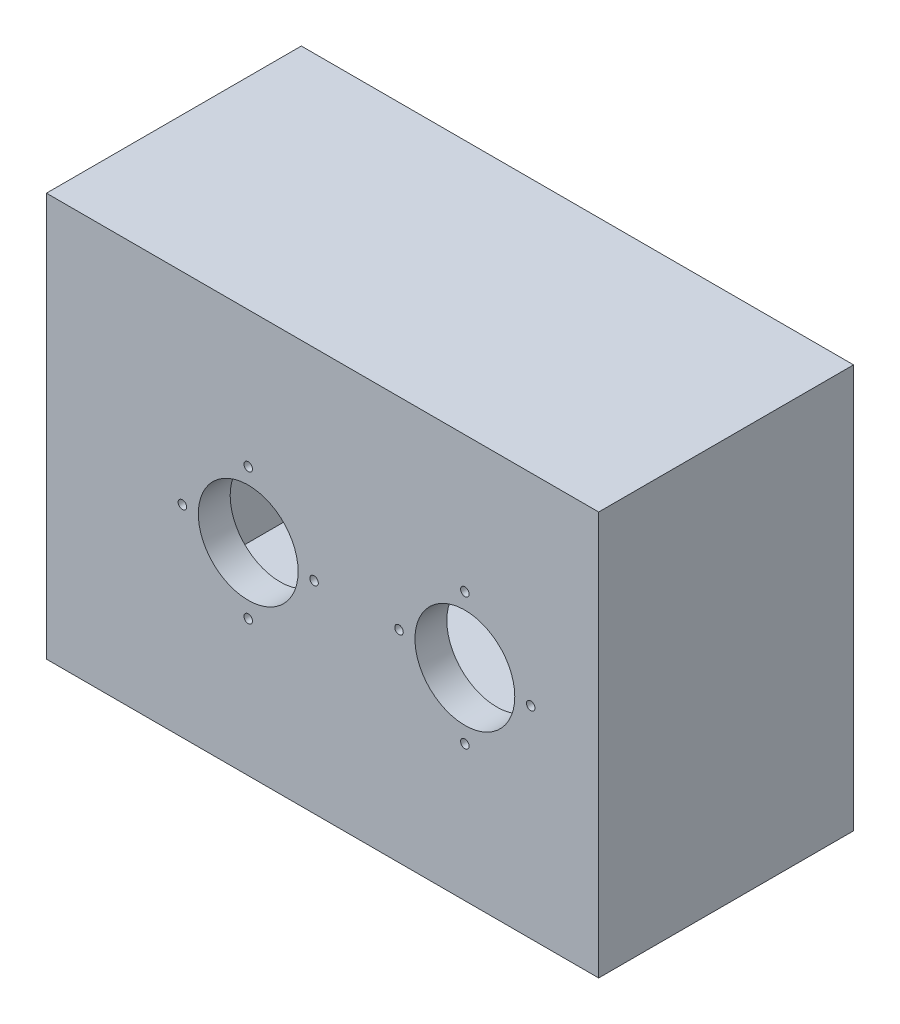
ISO-10303-21;
HEADER;
FILE_DESCRIPTION(('STEP AP214'),'2;1');
FILE_NAME('part.step','',(''),(''),'','','');
FILE_SCHEMA(('AUTOMOTIVE_DESIGN { 1 0 10303 214 1 1 1 1 }'));
ENDSEC;
DATA;
#1=APPLICATION_CONTEXT('core data for automotive mechanical design processes');
#2=APPLICATION_PROTOCOL_DEFINITION('international standard','automotive_design',2000,#1);
#3=PRODUCT_CONTEXT('',#1,'mechanical');
#4=PRODUCT('Part','Part','',(#3));
#5=PRODUCT_RELATED_PRODUCT_CATEGORY('part','',(#4));
#6=PRODUCT_DEFINITION_FORMATION('','',#4);
#7=PRODUCT_DEFINITION_CONTEXT('part definition',#1,'design');
#8=PRODUCT_DEFINITION('design','',#6,#7);
#9=PRODUCT_DEFINITION_SHAPE('','',#8);
#10=(LENGTH_UNIT() NAMED_UNIT(*) SI_UNIT(.MILLI.,.METRE.));
#11=(NAMED_UNIT(*) PLANE_ANGLE_UNIT() SI_UNIT($,.RADIAN.));
#12=(NAMED_UNIT(*) SI_UNIT($,.STERADIAN.) SOLID_ANGLE_UNIT());
#13=UNCERTAINTY_MEASURE_WITH_UNIT(LENGTH_MEASURE(1.E-05),#10,'distance_accuracy_value','');
#14=(GEOMETRIC_REPRESENTATION_CONTEXT(3) GLOBAL_UNCERTAINTY_ASSIGNED_CONTEXT((#13)) GLOBAL_UNIT_ASSIGNED_CONTEXT((#10,
#11,#12)) REPRESENTATION_CONTEXT('',''));
#15=CARTESIAN_POINT('',(0.,0.,0.));
#16=DIRECTION('',(0.,0.,1.));
#17=DIRECTION('',(1.,0.,0.));
#18=AXIS2_PLACEMENT_3D('',#15,#16,#17);
#19=CARTESIAN_POINT('',(-130.,190.,-45.));
#20=DIRECTION('',(0.,0.,1.));
#21=DIRECTION('',(1.,0.,0.));
#22=AXIS2_PLACEMENT_3D('',#19,#20,#21);
#23=PLANE('',#22);
#24=CARTESIAN_POINT('',(67.,126.,-45.));
#25=DIRECTION('',(0.,0.,1.));
#26=DIRECTION('',(1.,0.,0.));
#27=AXIS2_PLACEMENT_3D('',#24,#25,#26);
#28=CIRCLE('',#27,2.00000000000001);
#29=CARTESIAN_POINT('',(69.,126.,-45.));
#30=VERTEX_POINT('',#29);
#31=EDGE_CURVE('E367',#30,#30,#28,.F.);
#32=ORIENTED_EDGE('',*,*,#31,.T.);
#33=EDGE_LOOP('',(#32));
#34=FACE_BOUND('',#33,.T.);
#35=CARTESIAN_POINT('',(98.,95.,-45.));
#36=DIRECTION('',(0.,0.,1.));
#37=DIRECTION('',(1.,0.,0.));
#38=AXIS2_PLACEMENT_3D('',#35,#36,#37);
#39=CIRCLE('',#38,2.);
#40=CARTESIAN_POINT('',(100.,95.,-45.));
#41=VERTEX_POINT('',#40);
#42=EDGE_CURVE('E361',#41,#41,#39,.F.);
#43=ORIENTED_EDGE('',*,*,#42,.T.);
#44=EDGE_LOOP('',(#43));
#45=FACE_BOUND('',#44,.T.);
#46=CARTESIAN_POINT('',(67.,64.,-45.));
#47=DIRECTION('',(0.,0.,1.));
#48=DIRECTION('',(1.,0.,0.));
#49=AXIS2_PLACEMENT_3D('',#46,#47,#48);
#50=CIRCLE('',#49,2.00000000000001);
#51=CARTESIAN_POINT('',(69.,64.,-45.));
#52=VERTEX_POINT('',#51);
#53=EDGE_CURVE('E355',#52,#52,#50,.F.);
#54=ORIENTED_EDGE('',*,*,#53,.T.);
#55=EDGE_LOOP('',(#54));
#56=FACE_BOUND('',#55,.T.);
#57=CARTESIAN_POINT('',(36.,95.,-45.));
#58=DIRECTION('',(0.,0.,1.));
#59=DIRECTION('',(1.,0.,0.));
#60=AXIS2_PLACEMENT_3D('',#57,#58,#59);
#61=CIRCLE('',#60,2.);
#62=CARTESIAN_POINT('',(38.,95.,-45.));
#63=VERTEX_POINT('',#62);
#64=EDGE_CURVE('E345',#63,#63,#61,.F.);
#65=ORIENTED_EDGE('',*,*,#64,.T.);
#66=EDGE_LOOP('',(#65));
#67=FACE_BOUND('',#66,.T.);
#68=CARTESIAN_POINT('',(-35.,95.,-45.));
#69=DIRECTION('',(0.,0.,1.));
#70=DIRECTION('',(1.,0.,0.));
#71=AXIS2_PLACEMENT_3D('',#68,#69,#70);
#72=CIRCLE('',#71,23.5);
#73=CARTESIAN_POINT('',(-11.5,95.,-45.));
#74=VERTEX_POINT('',#73);
#75=EDGE_CURVE('E148',#74,#74,#72,.T.);
#76=ORIENTED_EDGE('',*,*,#75,.F.);
#77=EDGE_LOOP('',(#76));
#78=FACE_BOUND('',#77,.T.);
#79=CARTESIAN_POINT('',(67.,95.,-45.));
#80=DIRECTION('',(0.,0.,1.));
#81=DIRECTION('',(1.,0.,0.));
#82=AXIS2_PLACEMENT_3D('',#79,#80,#81);
#83=CIRCLE('',#82,23.5);
#84=CARTESIAN_POINT('',(90.5,95.,-45.));
#85=VERTEX_POINT('',#84);
#86=EDGE_CURVE('E231',#85,#85,#83,.T.);
#87=ORIENTED_EDGE('',*,*,#86,.F.);
#88=EDGE_LOOP('',(#87));
#89=FACE_BOUND('',#88,.T.);
#90=DIRECTION('',(-1.,0.,0.));
#91=VECTOR('',#90,1.);
#92=CARTESIAN_POINT('',(-130.,15.,-45.));
#93=LINE('',#92,#91);
#94=CARTESIAN_POINT('',(115.,15.,-45.));
#95=VERTEX_POINT('',#94);
#96=CARTESIAN_POINT('',(-115.,15.,-45.));
#97=VERTEX_POINT('',#96);
#98=EDGE_CURVE('E58',#95,#97,#93,.T.);
#99=ORIENTED_EDGE('',*,*,#98,.F.);
#100=DIRECTION('',(0.,-1.,0.));
#101=VECTOR('',#100,1.);
#102=CARTESIAN_POINT('',(115.,190.,-45.));
#103=LINE('',#102,#101);
#104=CARTESIAN_POINT('',(115.,175.,-45.));
#105=VERTEX_POINT('',#104);
#106=EDGE_CURVE('E168',#105,#95,#103,.T.);
#107=ORIENTED_EDGE('',*,*,#106,.F.);
#108=DIRECTION('',(-1.,0.,0.));
#109=VECTOR('',#108,1.);
#110=CARTESIAN_POINT('',(-130.,175.,-45.));
#111=LINE('',#110,#109);
#112=CARTESIAN_POINT('',(-115.,175.,-45.));
#113=VERTEX_POINT('',#112);
#114=EDGE_CURVE('E81',#105,#113,#111,.T.);
#115=ORIENTED_EDGE('',*,*,#114,.T.);
#116=DIRECTION('',(0.,-1.,0.));
#117=VECTOR('',#116,1.);
#118=CARTESIAN_POINT('',(-115.,190.,-45.));
#119=LINE('',#118,#117);
#120=EDGE_CURVE('E164',#113,#97,#119,.T.);
#121=ORIENTED_EDGE('',*,*,#120,.T.);
#122=EDGE_LOOP('',(#99,#107,#115,#121));
#123=FACE_BOUND('',#122,.T.);
#124=CARTESIAN_POINT('',(-4.,95.,-45.));
#125=DIRECTION('',(0.,0.,1.));
#126=DIRECTION('',(1.,0.,0.));
#127=AXIS2_PLACEMENT_3D('',#124,#125,#126);
#128=CIRCLE('',#127,2.);
#129=CARTESIAN_POINT('',(-2.00000000000001,95.,-45.));
#130=VERTEX_POINT('',#129);
#131=EDGE_CURVE('E349',#130,#130,#128,.T.);
#132=ORIENTED_EDGE('',*,*,#131,.F.);
#133=EDGE_LOOP('',(#132));
#134=FACE_BOUND('',#133,.T.);
#135=CARTESIAN_POINT('',(-35.,64.,-45.));
#136=DIRECTION('',(0.,0.,1.));
#137=DIRECTION('',(1.,0.,0.));
#138=AXIS2_PLACEMENT_3D('',#135,#136,#137);
#139=CIRCLE('',#138,2.);
#140=CARTESIAN_POINT('',(-33.,64.,-45.));
#141=VERTEX_POINT('',#140);
#142=EDGE_CURVE('E371',#141,#141,#139,.T.);
#143=ORIENTED_EDGE('',*,*,#142,.F.);
#144=EDGE_LOOP('',(#143));
#145=FACE_BOUND('',#144,.T.);
#146=CARTESIAN_POINT('',(-66.,95.,-45.));
#147=DIRECTION('',(0.,0.,1.));
#148=DIRECTION('',(1.,0.,0.));
#149=AXIS2_PLACEMENT_3D('',#146,#147,#148);
#150=CIRCLE('',#149,2.);
#151=CARTESIAN_POINT('',(-64.,95.,-45.));
#152=VERTEX_POINT('',#151);
#153=EDGE_CURVE('E208',#152,#152,#150,.T.);
#154=ORIENTED_EDGE('',*,*,#153,.F.);
#155=EDGE_LOOP('',(#154));
#156=FACE_BOUND('',#155,.T.);
#157=CARTESIAN_POINT('',(-35.,126.,-45.));
#158=DIRECTION('',(0.,0.,1.));
#159=DIRECTION('',(1.,0.,0.));
#160=AXIS2_PLACEMENT_3D('',#157,#158,#159);
#161=CIRCLE('',#160,2.);
#162=CARTESIAN_POINT('',(-33.,126.,-45.));
#163=VERTEX_POINT('',#162);
#164=EDGE_CURVE('E207',#163,#163,#161,.T.);
#165=ORIENTED_EDGE('',*,*,#164,.F.);
#166=EDGE_LOOP('',(#165));
#167=FACE_BOUND('',#166,.T.);
#168=ADVANCED_FACE('F39',(#34,#45,#56,#67,#78,#89,#123,#134,#145,#156,#167),#23,.T.);
#169=CARTESIAN_POINT('',(-130.,190.,45.));
#170=DIRECTION('',(0.,0.,-1.));
#171=DIRECTION('',(-1.,0.,0.));
#172=AXIS2_PLACEMENT_3D('',#169,#170,#171);
#173=PLANE('',#172);
#174=CARTESIAN_POINT('',(67.,126.,45.));
#175=DIRECTION('',(0.,0.,-1.));
#176=DIRECTION('',(-1.,0.,0.));
#177=AXIS2_PLACEMENT_3D('',#174,#175,#176);
#178=CIRCLE('',#177,2.00000000000001);
#179=CARTESIAN_POINT('',(65.,126.,45.));
#180=VERTEX_POINT('',#179);
#181=EDGE_CURVE('E364',#180,#180,#178,.F.);
#182=ORIENTED_EDGE('',*,*,#181,.T.);
#183=EDGE_LOOP('',(#182));
#184=FACE_BOUND('',#183,.T.);
#185=CARTESIAN_POINT('',(98.,95.,45.));
#186=DIRECTION('',(0.,0.,-1.));
#187=DIRECTION('',(-1.,0.,0.));
#188=AXIS2_PLACEMENT_3D('',#185,#186,#187);
#189=CIRCLE('',#188,2.);
#190=CARTESIAN_POINT('',(96.,95.,45.));
#191=VERTEX_POINT('',#190);
#192=EDGE_CURVE('E358',#191,#191,#189,.F.);
#193=ORIENTED_EDGE('',*,*,#192,.T.);
#194=EDGE_LOOP('',(#193));
#195=FACE_BOUND('',#194,.T.);
#196=CARTESIAN_POINT('',(67.,64.,45.));
#197=DIRECTION('',(0.,0.,-1.));
#198=DIRECTION('',(-1.,0.,0.));
#199=AXIS2_PLACEMENT_3D('',#196,#197,#198);
#200=CIRCLE('',#199,2.00000000000001);
#201=CARTESIAN_POINT('',(65.,64.,45.));
#202=VERTEX_POINT('',#201);
#203=EDGE_CURVE('E352',#202,#202,#200,.F.);
#204=ORIENTED_EDGE('',*,*,#203,.T.);
#205=EDGE_LOOP('',(#204));
#206=FACE_BOUND('',#205,.T.);
#207=CARTESIAN_POINT('',(36.,95.,45.));
#208=DIRECTION('',(0.,0.,-1.));
#209=DIRECTION('',(-1.,0.,0.));
#210=AXIS2_PLACEMENT_3D('',#207,#208,#209);
#211=CIRCLE('',#210,2.);
#212=CARTESIAN_POINT('',(34.,95.,45.));
#213=VERTEX_POINT('',#212);
#214=EDGE_CURVE('E339',#213,#213,#211,.F.);
#215=ORIENTED_EDGE('',*,*,#214,.T.);
#216=EDGE_LOOP('',(#215));
#217=FACE_BOUND('',#216,.T.);
#218=CARTESIAN_POINT('',(-35.,95.,45.));
#219=DIRECTION('',(0.,0.,-1.));
#220=DIRECTION('',(-1.,0.,0.));
#221=AXIS2_PLACEMENT_3D('',#218,#219,#220);
#222=CIRCLE('',#221,23.5);
#223=CARTESIAN_POINT('',(-58.5,95.,45.));
#224=VERTEX_POINT('',#223);
#225=EDGE_CURVE('E234',#224,#224,#222,.T.);
#226=ORIENTED_EDGE('',*,*,#225,.F.);
#227=EDGE_LOOP('',(#226));
#228=FACE_BOUND('',#227,.T.);
#229=CARTESIAN_POINT('',(67.,95.,45.));
#230=DIRECTION('',(0.,0.,-1.));
#231=DIRECTION('',(-1.,0.,0.));
#232=AXIS2_PLACEMENT_3D('',#229,#230,#231);
#233=CIRCLE('',#232,23.5);
#234=CARTESIAN_POINT('',(43.5,95.,45.));
#235=VERTEX_POINT('',#234);
#236=EDGE_CURVE('E220',#235,#235,#233,.T.);
#237=ORIENTED_EDGE('',*,*,#236,.F.);
#238=EDGE_LOOP('',(#237));
#239=FACE_BOUND('',#238,.T.);
#240=DIRECTION('',(1.,0.,0.));
#241=VECTOR('',#240,1.);
#242=CARTESIAN_POINT('',(-130.,15.,45.));
#243=LINE('',#242,#241);
#244=CARTESIAN_POINT('',(-115.,15.,45.));
#245=VERTEX_POINT('',#244);
#246=CARTESIAN_POINT('',(115.,15.,45.));
#247=VERTEX_POINT('',#246);
#248=EDGE_CURVE('E162',#245,#247,#243,.T.);
#249=ORIENTED_EDGE('',*,*,#248,.F.);
#250=DIRECTION('',(0.,-1.,0.));
#251=VECTOR('',#250,1.);
#252=CARTESIAN_POINT('',(-115.,190.,45.));
#253=LINE('',#252,#251);
#254=CARTESIAN_POINT('',(-115.,175.,45.));
#255=VERTEX_POINT('',#254);
#256=EDGE_CURVE('E159',#255,#245,#253,.T.);
#257=ORIENTED_EDGE('',*,*,#256,.F.);
#258=DIRECTION('',(1.,0.,0.));
#259=VECTOR('',#258,1.);
#260=CARTESIAN_POINT('',(-130.,175.,45.));
#261=LINE('',#260,#259);
#262=CARTESIAN_POINT('',(115.,175.,45.));
#263=VERTEX_POINT('',#262);
#264=EDGE_CURVE('E12',#255,#263,#261,.T.);
#265=ORIENTED_EDGE('',*,*,#264,.T.);
#266=DIRECTION('',(0.,-1.,0.));
#267=VECTOR('',#266,1.);
#268=CARTESIAN_POINT('',(115.,190.,45.));
#269=LINE('',#268,#267);
#270=EDGE_CURVE('E170',#263,#247,#269,.T.);
#271=ORIENTED_EDGE('',*,*,#270,.T.);
#272=EDGE_LOOP('',(#249,#257,#265,#271));
#273=FACE_BOUND('',#272,.T.);
#274=CARTESIAN_POINT('',(-4.,95.,45.));
#275=DIRECTION('',(0.,0.,-1.));
#276=DIRECTION('',(-1.,0.,0.));
#277=AXIS2_PLACEMENT_3D('',#274,#275,#276);
#278=CIRCLE('',#277,2.);
#279=CARTESIAN_POINT('',(-6.,95.,45.));
#280=VERTEX_POINT('',#279);
#281=EDGE_CURVE('E194',#280,#280,#278,.T.);
#282=ORIENTED_EDGE('',*,*,#281,.F.);
#283=EDGE_LOOP('',(#282));
#284=FACE_BOUND('',#283,.T.);
#285=CARTESIAN_POINT('',(-35.,64.,45.));
#286=DIRECTION('',(0.,0.,-1.));
#287=DIRECTION('',(-1.,0.,0.));
#288=AXIS2_PLACEMENT_3D('',#285,#286,#287);
#289=CIRCLE('',#288,2.);
#290=CARTESIAN_POINT('',(-37.,64.,45.));
#291=VERTEX_POINT('',#290);
#292=EDGE_CURVE('E198',#291,#291,#289,.T.);
#293=ORIENTED_EDGE('',*,*,#292,.F.);
#294=EDGE_LOOP('',(#293));
#295=FACE_BOUND('',#294,.T.);
#296=CARTESIAN_POINT('',(-66.,95.,45.));
#297=DIRECTION('',(0.,0.,-1.));
#298=DIRECTION('',(-1.,0.,0.));
#299=AXIS2_PLACEMENT_3D('',#296,#297,#298);
#300=CIRCLE('',#299,2.);
#301=CARTESIAN_POINT('',(-68.,95.,45.));
#302=VERTEX_POINT('',#301);
#303=EDGE_CURVE('E202',#302,#302,#300,.T.);
#304=ORIENTED_EDGE('',*,*,#303,.F.);
#305=EDGE_LOOP('',(#304));
#306=FACE_BOUND('',#305,.T.);
#307=CARTESIAN_POINT('',(-35.,126.,45.));
#308=DIRECTION('',(0.,0.,-1.));
#309=DIRECTION('',(-1.,0.,0.));
#310=AXIS2_PLACEMENT_3D('',#307,#308,#309);
#311=CIRCLE('',#310,2.);
#312=CARTESIAN_POINT('',(-37.,126.,45.));
#313=VERTEX_POINT('',#312);
#314=EDGE_CURVE('E205',#313,#313,#311,.T.);
#315=ORIENTED_EDGE('',*,*,#314,.F.);
#316=EDGE_LOOP('',(#315));
#317=FACE_BOUND('',#316,.T.);
#318=ADVANCED_FACE('F186',(#184,#195,#206,#217,#228,#239,#273,#284,#295,#306,#317),#173,.T.);
#319=CARTESIAN_POINT('',(-130.,190.,-60.));
#320=DIRECTION('',(0.,0.,1.));
#321=DIRECTION('',(1.,0.,0.));
#322=AXIS2_PLACEMENT_3D('',#319,#320,#321);
#323=PLANE('',#322);
#324=CARTESIAN_POINT('',(-66.,95.,-60.));
#325=DIRECTION('',(0.,0.,1.));
#326=DIRECTION('',(1.,0.,0.));
#327=AXIS2_PLACEMENT_3D('',#324,#325,#326);
#328=CIRCLE('',#327,2.);
#329=CARTESIAN_POINT('',(-64.,95.,-60.));
#330=VERTEX_POINT('',#329);
#331=EDGE_CURVE('E327',#330,#330,#328,.T.);
#332=ORIENTED_EDGE('',*,*,#331,.T.);
#333=EDGE_LOOP('',(#332));
#334=FACE_BOUND('',#333,.T.);
#335=CARTESIAN_POINT('',(-4.,95.,-60.));
#336=DIRECTION('',(0.,0.,1.));
#337=DIRECTION('',(1.,0.,0.));
#338=AXIS2_PLACEMENT_3D('',#335,#336,#337);
#339=CIRCLE('',#338,2.);
#340=CARTESIAN_POINT('',(-2.00000000000001,95.,-60.));
#341=VERTEX_POINT('',#340);
#342=EDGE_CURVE('E388',#341,#341,#339,.T.);
#343=ORIENTED_EDGE('',*,*,#342,.T.);
#344=EDGE_LOOP('',(#343));
#345=FACE_BOUND('',#344,.T.);
#346=CARTESIAN_POINT('',(36.,95.,-60.));
#347=DIRECTION('',(0.,0.,1.));
#348=DIRECTION('',(1.,0.,0.));
#349=AXIS2_PLACEMENT_3D('',#346,#347,#348);
#350=CIRCLE('',#349,2.);
#351=CARTESIAN_POINT('',(38.,95.,-60.));
#352=VERTEX_POINT('',#351);
#353=EDGE_CURVE('E336',#352,#352,#350,.F.);
#354=ORIENTED_EDGE('',*,*,#353,.F.);
#355=EDGE_LOOP('',(#354));
#356=FACE_BOUND('',#355,.T.);
#357=CARTESIAN_POINT('',(-35.,95.,-60.));
#358=DIRECTION('',(0.,0.,1.));
#359=DIRECTION('',(1.,0.,0.));
#360=AXIS2_PLACEMENT_3D('',#357,#358,#359);
#361=CIRCLE('',#360,23.5);
#362=CARTESIAN_POINT('',(-11.5,95.,-60.));
#363=VERTEX_POINT('',#362);
#364=EDGE_CURVE('E217',#363,#363,#361,.T.);
#365=ORIENTED_EDGE('',*,*,#364,.T.);
#366=EDGE_LOOP('',(#365));
#367=FACE_BOUND('',#366,.T.);
#368=CARTESIAN_POINT('',(67.,95.,-60.));
#369=DIRECTION('',(0.,0.,1.));
#370=DIRECTION('',(1.,0.,0.));
#371=AXIS2_PLACEMENT_3D('',#368,#369,#370);
#372=CIRCLE('',#371,23.5);
#373=CARTESIAN_POINT('',(90.5,95.,-60.));
#374=VERTEX_POINT('',#373);
#375=EDGE_CURVE('E211',#374,#374,#372,.T.);
#376=ORIENTED_EDGE('',*,*,#375,.T.);
#377=EDGE_LOOP('',(#376));
#378=FACE_BOUND('',#377,.T.);
#379=DIRECTION('',(-1.,0.,0.));
#380=VECTOR('',#379,1.);
#381=CARTESIAN_POINT('',(-130.,0.,-60.));
#382=LINE('',#381,#380);
#383=CARTESIAN_POINT('',(130.,0.,-60.));
#384=VERTEX_POINT('',#383);
#385=CARTESIAN_POINT('',(-130.,0.,-60.));
#386=VERTEX_POINT('',#385);
#387=EDGE_CURVE('E135',#384,#386,#382,.T.);
#388=ORIENTED_EDGE('',*,*,#387,.T.);
#389=DIRECTION('',(0.,-1.,0.));
#390=VECTOR('',#389,1.);
#391=CARTESIAN_POINT('',(-130.,190.,-60.));
#392=LINE('',#391,#390);
#393=CARTESIAN_POINT('',(-130.,190.,-60.));
#394=VERTEX_POINT('',#393);
#395=EDGE_CURVE('E132',#394,#386,#392,.T.);
#396=ORIENTED_EDGE('',*,*,#395,.F.);
#397=DIRECTION('',(-1.,0.,0.));
#398=VECTOR('',#397,1.);
#399=CARTESIAN_POINT('',(-130.,190.,-60.));
#400=LINE('',#399,#398);
#401=CARTESIAN_POINT('',(130.,190.,-60.));
#402=VERTEX_POINT('',#401);
#403=EDGE_CURVE('E124',#402,#394,#400,.T.);
#404=ORIENTED_EDGE('',*,*,#403,.F.);
#405=DIRECTION('',(0.,-1.,0.));
#406=VECTOR('',#405,1.);
#407=CARTESIAN_POINT('',(130.,190.,-60.));
#408=LINE('',#407,#406);
#409=EDGE_CURVE('E136',#402,#384,#408,.T.);
#410=ORIENTED_EDGE('',*,*,#409,.T.);
#411=EDGE_LOOP('',(#388,#396,#404,#410));
#412=FACE_BOUND('',#411,.T.);
#413=CARTESIAN_POINT('',(67.,64.,-60.));
#414=DIRECTION('',(0.,0.,1.));
#415=DIRECTION('',(1.,0.,0.));
#416=AXIS2_PLACEMENT_3D('',#413,#414,#415);
#417=CIRCLE('',#416,2.00000000000001);
#418=CARTESIAN_POINT('',(69.,64.,-60.));
#419=VERTEX_POINT('',#418);
#420=EDGE_CURVE('E402',#419,#419,#417,.F.);
#421=ORIENTED_EDGE('',*,*,#420,.F.);
#422=EDGE_LOOP('',(#421));
#423=FACE_BOUND('',#422,.T.);
#424=CARTESIAN_POINT('',(98.,95.,-60.));
#425=DIRECTION('',(0.,0.,1.));
#426=DIRECTION('',(1.,0.,0.));
#427=AXIS2_PLACEMENT_3D('',#424,#425,#426);
#428=CIRCLE('',#427,2.);
#429=CARTESIAN_POINT('',(100.,95.,-60.));
#430=VERTEX_POINT('',#429);
#431=EDGE_CURVE('E389',#430,#430,#428,.F.);
#432=ORIENTED_EDGE('',*,*,#431,.F.);
#433=EDGE_LOOP('',(#432));
#434=FACE_BOUND('',#433,.T.);
#435=CARTESIAN_POINT('',(67.,126.,-60.));
#436=DIRECTION('',(0.,0.,1.));
#437=DIRECTION('',(1.,0.,0.));
#438=AXIS2_PLACEMENT_3D('',#435,#436,#437);
#439=CIRCLE('',#438,2.00000000000001);
#440=CARTESIAN_POINT('',(69.,126.,-60.));
#441=VERTEX_POINT('',#440);
#442=EDGE_CURVE('E393',#441,#441,#439,.F.);
#443=ORIENTED_EDGE('',*,*,#442,.F.);
#444=EDGE_LOOP('',(#443));
#445=FACE_BOUND('',#444,.T.);
#446=CARTESIAN_POINT('',(-35.,64.,-60.));
#447=DIRECTION('',(0.,0.,1.));
#448=DIRECTION('',(1.,0.,0.));
#449=AXIS2_PLACEMENT_3D('',#446,#447,#448);
#450=CIRCLE('',#449,2.);
#451=CARTESIAN_POINT('',(-33.,64.,-60.));
#452=VERTEX_POINT('',#451);
#453=EDGE_CURVE('E383',#452,#452,#450,.T.);
#454=ORIENTED_EDGE('',*,*,#453,.T.);
#455=EDGE_LOOP('',(#454));
#456=FACE_BOUND('',#455,.T.);
#457=CARTESIAN_POINT('',(-35.,126.,-60.));
#458=DIRECTION('',(0.,0.,1.));
#459=DIRECTION('',(1.,0.,0.));
#460=AXIS2_PLACEMENT_3D('',#457,#458,#459);
#461=CIRCLE('',#460,2.);
#462=CARTESIAN_POINT('',(-33.,126.,-60.));
#463=VERTEX_POINT('',#462);
#464=EDGE_CURVE('E328',#463,#463,#461,.T.);
#465=ORIENTED_EDGE('',*,*,#464,.T.);
#466=EDGE_LOOP('',(#465));
#467=FACE_BOUND('',#466,.T.);
#468=ADVANCED_FACE('F133',(#334,#345,#356,#367,#378,#412,#423,#434,#445,#456,#467),#323,.F.);
#469=CARTESIAN_POINT('',(-130.,190.,60.));
#470=DIRECTION('',(0.,0.,-1.));
#471=DIRECTION('',(-1.,0.,0.));
#472=AXIS2_PLACEMENT_3D('',#469,#470,#471);
#473=PLANE('',#472);
#474=CARTESIAN_POINT('',(-66.,95.,60.));
#475=DIRECTION('',(0.,0.,1.));
#476=DIRECTION('',(1.,0.,0.));
#477=AXIS2_PLACEMENT_3D('',#474,#475,#476);
#478=CIRCLE('',#477,2.);
#479=CARTESIAN_POINT('',(-64.,95.,60.));
#480=VERTEX_POINT('',#479);
#481=EDGE_CURVE('E330',#480,#480,#478,.T.);
#482=ORIENTED_EDGE('',*,*,#481,.F.);
#483=EDGE_LOOP('',(#482));
#484=FACE_BOUND('',#483,.T.);
#485=CARTESIAN_POINT('',(-4.,95.,60.));
#486=DIRECTION('',(0.,0.,1.));
#487=DIRECTION('',(1.,0.,0.));
#488=AXIS2_PLACEMENT_3D('',#485,#486,#487);
#489=CIRCLE('',#488,2.);
#490=CARTESIAN_POINT('',(-2.00000000000001,95.,60.));
#491=VERTEX_POINT('',#490);
#492=EDGE_CURVE('E399',#491,#491,#489,.T.);
#493=ORIENTED_EDGE('',*,*,#492,.F.);
#494=EDGE_LOOP('',(#493));
#495=FACE_BOUND('',#494,.T.);
#496=CARTESIAN_POINT('',(36.,95.,60.));
#497=DIRECTION('',(0.,0.,1.));
#498=DIRECTION('',(1.,0.,0.));
#499=AXIS2_PLACEMENT_3D('',#496,#497,#498);
#500=CIRCLE('',#499,2.);
#501=CARTESIAN_POINT('',(38.,95.,60.));
#502=VERTEX_POINT('',#501);
#503=EDGE_CURVE('E340',#502,#502,#500,.F.);
#504=ORIENTED_EDGE('',*,*,#503,.T.);
#505=EDGE_LOOP('',(#504));
#506=FACE_BOUND('',#505,.T.);
#507=CARTESIAN_POINT('',(-35.,95.,60.));
#508=DIRECTION('',(0.,0.,1.));
#509=DIRECTION('',(1.,0.,0.));
#510=AXIS2_PLACEMENT_3D('',#507,#508,#509);
#511=CIRCLE('',#510,23.5);
#512=CARTESIAN_POINT('',(-11.5,95.,60.));
#513=VERTEX_POINT('',#512);
#514=EDGE_CURVE('E221',#513,#513,#511,.T.);
#515=ORIENTED_EDGE('',*,*,#514,.F.);
#516=EDGE_LOOP('',(#515));
#517=FACE_BOUND('',#516,.T.);
#518=CARTESIAN_POINT('',(67.,95.,60.));
#519=DIRECTION('',(0.,0.,1.));
#520=DIRECTION('',(1.,0.,0.));
#521=AXIS2_PLACEMENT_3D('',#518,#519,#520);
#522=CIRCLE('',#521,23.5);
#523=CARTESIAN_POINT('',(90.5,95.,60.));
#524=VERTEX_POINT('',#523);
#525=EDGE_CURVE('E224',#524,#524,#522,.T.);
#526=ORIENTED_EDGE('',*,*,#525,.F.);
#527=EDGE_LOOP('',(#526));
#528=FACE_BOUND('',#527,.T.);
#529=DIRECTION('',(1.,0.,0.));
#530=VECTOR('',#529,1.);
#531=CARTESIAN_POINT('',(-130.,0.,60.));
#532=LINE('',#531,#530);
#533=CARTESIAN_POINT('',(-130.,0.,60.));
#534=VERTEX_POINT('',#533);
#535=CARTESIAN_POINT('',(130.,0.,60.));
#536=VERTEX_POINT('',#535);
#537=EDGE_CURVE('E116',#534,#536,#532,.T.);
#538=ORIENTED_EDGE('',*,*,#537,.T.);
#539=DIRECTION('',(0.,-1.,0.));
#540=VECTOR('',#539,1.);
#541=CARTESIAN_POINT('',(130.,190.,60.));
#542=LINE('',#541,#540);
#543=CARTESIAN_POINT('',(130.,190.,60.));
#544=VERTEX_POINT('',#543);
#545=EDGE_CURVE('E141',#544,#536,#542,.T.);
#546=ORIENTED_EDGE('',*,*,#545,.F.);
#547=DIRECTION('',(1.,0.,0.));
#548=VECTOR('',#547,1.);
#549=CARTESIAN_POINT('',(-130.,190.,60.));
#550=LINE('',#549,#548);
#551=CARTESIAN_POINT('',(-130.,190.,60.));
#552=VERTEX_POINT('',#551);
#553=EDGE_CURVE('E93',#552,#544,#550,.T.);
#554=ORIENTED_EDGE('',*,*,#553,.F.);
#555=DIRECTION('',(0.,-1.,0.));
#556=VECTOR('',#555,1.);
#557=CARTESIAN_POINT('',(-130.,190.,60.));
#558=LINE('',#557,#556);
#559=EDGE_CURVE('E137',#552,#534,#558,.T.);
#560=ORIENTED_EDGE('',*,*,#559,.T.);
#561=EDGE_LOOP('',(#538,#546,#554,#560));
#562=FACE_BOUND('',#561,.T.);
#563=CARTESIAN_POINT('',(67.,64.,60.));
#564=DIRECTION('',(0.,0.,1.));
#565=DIRECTION('',(1.,0.,0.));
#566=AXIS2_PLACEMENT_3D('',#563,#564,#565);
#567=CIRCLE('',#566,2.00000000000001);
#568=CARTESIAN_POINT('',(69.,64.,60.));
#569=VERTEX_POINT('',#568);
#570=EDGE_CURVE('E310',#569,#569,#567,.F.);
#571=ORIENTED_EDGE('',*,*,#570,.T.);
#572=EDGE_LOOP('',(#571));
#573=FACE_BOUND('',#572,.T.);
#574=CARTESIAN_POINT('',(98.,95.,60.));
#575=DIRECTION('',(0.,0.,1.));
#576=DIRECTION('',(1.,0.,0.));
#577=AXIS2_PLACEMENT_3D('',#574,#575,#576);
#578=CIRCLE('',#577,2.);
#579=CARTESIAN_POINT('',(100.,95.,60.));
#580=VERTEX_POINT('',#579);
#581=EDGE_CURVE('E314',#580,#580,#578,.F.);
#582=ORIENTED_EDGE('',*,*,#581,.T.);
#583=EDGE_LOOP('',(#582));
#584=FACE_BOUND('',#583,.T.);
#585=CARTESIAN_POINT('',(67.,126.,60.));
#586=DIRECTION('',(0.,0.,1.));
#587=DIRECTION('',(1.,0.,0.));
#588=AXIS2_PLACEMENT_3D('',#585,#586,#587);
#589=CIRCLE('',#588,2.00000000000001);
#590=CARTESIAN_POINT('',(69.,126.,60.));
#591=VERTEX_POINT('',#590);
#592=EDGE_CURVE('E318',#591,#591,#589,.F.);
#593=ORIENTED_EDGE('',*,*,#592,.T.);
#594=EDGE_LOOP('',(#593));
#595=FACE_BOUND('',#594,.T.);
#596=CARTESIAN_POINT('',(-35.,64.,60.));
#597=DIRECTION('',(0.,0.,1.));
#598=DIRECTION('',(1.,0.,0.));
#599=AXIS2_PLACEMENT_3D('',#596,#597,#598);
#600=CIRCLE('',#599,2.);
#601=CARTESIAN_POINT('',(-33.,64.,60.));
#602=VERTEX_POINT('',#601);
#603=EDGE_CURVE('E322',#602,#602,#600,.T.);
#604=ORIENTED_EDGE('',*,*,#603,.F.);
#605=EDGE_LOOP('',(#604));
#606=FACE_BOUND('',#605,.T.);
#607=CARTESIAN_POINT('',(-35.,126.,60.));
#608=DIRECTION('',(0.,0.,1.));
#609=DIRECTION('',(1.,0.,0.));
#610=AXIS2_PLACEMENT_3D('',#607,#608,#609);
#611=CIRCLE('',#610,2.);
#612=CARTESIAN_POINT('',(-33.,126.,60.));
#613=VERTEX_POINT('',#612);
#614=EDGE_CURVE('E325',#613,#613,#611,.T.);
#615=ORIENTED_EDGE('',*,*,#614,.F.);
#616=EDGE_LOOP('',(#615));
#617=FACE_BOUND('',#616,.T.);
#618=ADVANCED_FACE('F258',(#484,#495,#506,#517,#528,#562,#573,#584,#595,#606,#617),#473,.F.);
#619=CARTESIAN_POINT('',(115.,190.,-60.));
#620=DIRECTION('',(-1.,0.,0.));
#621=DIRECTION('',(0.,0.,1.));
#622=AXIS2_PLACEMENT_3D('',#619,#620,#621);
#623=PLANE('',#622);
#624=DIRECTION('',(0.,0.,-1.));
#625=VECTOR('',#624,1.);
#626=CARTESIAN_POINT('',(115.,15.,-60.));
#627=LINE('',#626,#625);
#628=EDGE_CURVE('E43',#247,#95,#627,.T.);
#629=ORIENTED_EDGE('',*,*,#628,.F.);
#630=ORIENTED_EDGE('',*,*,#270,.F.);
#631=DIRECTION('',(0.,0.,-1.));
#632=VECTOR('',#631,1.);
#633=CARTESIAN_POINT('',(115.,175.,-60.));
#634=LINE('',#633,#632);
#635=EDGE_CURVE('E157',#263,#105,#634,.T.);
#636=ORIENTED_EDGE('',*,*,#635,.T.);
#637=ORIENTED_EDGE('',*,*,#106,.T.);
#638=EDGE_LOOP('',(#629,#630,#636,#637));
#639=FACE_BOUND('',#638,.T.);
#640=ADVANCED_FACE('F177',(#639),#623,.T.);
#641=CARTESIAN_POINT('',(-115.,190.,-60.));
#642=DIRECTION('',(1.,0.,0.));
#643=DIRECTION('',(0.,0.,-1.));
#644=AXIS2_PLACEMENT_3D('',#641,#642,#643);
#645=PLANE('',#644);
#646=DIRECTION('',(0.,0.,1.));
#647=VECTOR('',#646,1.);
#648=CARTESIAN_POINT('',(-115.,15.,-60.));
#649=LINE('',#648,#647);
#650=EDGE_CURVE('E166',#97,#245,#649,.T.);
#651=ORIENTED_EDGE('',*,*,#650,.F.);
#652=ORIENTED_EDGE('',*,*,#120,.F.);
#653=DIRECTION('',(0.,0.,1.));
#654=VECTOR('',#653,1.);
#655=CARTESIAN_POINT('',(-115.,175.,-60.));
#656=LINE('',#655,#654);
#657=EDGE_CURVE('E49',#113,#255,#656,.T.);
#658=ORIENTED_EDGE('',*,*,#657,.T.);
#659=ORIENTED_EDGE('',*,*,#256,.T.);
#660=EDGE_LOOP('',(#651,#652,#658,#659));
#661=FACE_BOUND('',#660,.T.);
#662=ADVANCED_FACE('F182',(#661),#645,.T.);
#663=CARTESIAN_POINT('',(0.,175.,0.));
#664=DIRECTION('',(0.,1.,0.));
#665=DIRECTION('',(0.,0.,1.));
#666=AXIS2_PLACEMENT_3D('',#663,#664,#665);
#667=PLANE('',#666);
#668=ORIENTED_EDGE('',*,*,#635,.F.);
#669=ORIENTED_EDGE('',*,*,#264,.F.);
#670=ORIENTED_EDGE('',*,*,#657,.F.);
#671=ORIENTED_EDGE('',*,*,#114,.F.);
#672=EDGE_LOOP('',(#668,#669,#670,#671));
#673=FACE_BOUND('',#672,.T.);
#674=ADVANCED_FACE('F185',(#673),#667,.F.);
#675=CARTESIAN_POINT('',(0.,15.,0.));
#676=DIRECTION('',(0.,1.,0.));
#677=DIRECTION('',(0.,0.,1.));
#678=AXIS2_PLACEMENT_3D('',#675,#676,#677);
#679=PLANE('',#678);
#680=ORIENTED_EDGE('',*,*,#628,.T.);
#681=ORIENTED_EDGE('',*,*,#98,.T.);
#682=ORIENTED_EDGE('',*,*,#650,.T.);
#683=ORIENTED_EDGE('',*,*,#248,.T.);
#684=EDGE_LOOP('',(#680,#681,#682,#683));
#685=FACE_BOUND('',#684,.T.);
#686=ADVANCED_FACE('F41',(#685),#679,.T.);
#687=CARTESIAN_POINT('',(67.,95.,-60.));
#688=DIRECTION('',(0.,0.,1.));
#689=DIRECTION('',(1.,0.,0.));
#690=AXIS2_PLACEMENT_3D('',#687,#688,#689);
#691=CYLINDRICAL_SURFACE('',#690,23.5);
#692=ORIENTED_EDGE('',*,*,#236,.T.);
#693=EDGE_LOOP('',(#692));
#694=FACE_BOUND('',#693,.T.);
#695=ORIENTED_EDGE('',*,*,#525,.T.);
#696=EDGE_LOOP('',(#695));
#697=FACE_BOUND('',#696,.T.);
#698=ADVANCED_FACE('F254',(#694,#697),#691,.F.);
#699=CARTESIAN_POINT('',(-35.,95.,-60.));
#700=DIRECTION('',(0.,0.,1.));
#701=DIRECTION('',(1.,0.,0.));
#702=AXIS2_PLACEMENT_3D('',#699,#700,#701);
#703=CYLINDRICAL_SURFACE('',#702,23.5);
#704=ORIENTED_EDGE('',*,*,#225,.T.);
#705=EDGE_LOOP('',(#704));
#706=FACE_BOUND('',#705,.T.);
#707=ORIENTED_EDGE('',*,*,#514,.T.);
#708=EDGE_LOOP('',(#707));
#709=FACE_BOUND('',#708,.T.);
#710=ADVANCED_FACE('F252',(#706,#709),#703,.F.);
#711=ORIENTED_EDGE('',*,*,#86,.T.);
#712=EDGE_LOOP('',(#711));
#713=FACE_BOUND('',#712,.T.);
#714=ORIENTED_EDGE('',*,*,#375,.F.);
#715=EDGE_LOOP('',(#714));
#716=FACE_BOUND('',#715,.T.);
#717=ADVANCED_FACE('F249',(#713,#716),#691,.F.);
#718=ORIENTED_EDGE('',*,*,#75,.T.);
#719=EDGE_LOOP('',(#718));
#720=FACE_BOUND('',#719,.T.);
#721=ORIENTED_EDGE('',*,*,#364,.F.);
#722=EDGE_LOOP('',(#721));
#723=FACE_BOUND('',#722,.T.);
#724=ADVANCED_FACE('F240',(#720,#723),#703,.F.);
#725=CARTESIAN_POINT('',(-130.,190.,-60.));
#726=DIRECTION('',(1.,0.,0.));
#727=DIRECTION('',(0.,0.,-1.));
#728=AXIS2_PLACEMENT_3D('',#725,#726,#727);
#729=PLANE('',#728);
#730=DIRECTION('',(0.,0.,1.));
#731=VECTOR('',#730,1.);
#732=CARTESIAN_POINT('',(-130.,0.,-60.));
#733=LINE('',#732,#731);
#734=EDGE_CURVE('E110',#386,#534,#733,.T.);
#735=ORIENTED_EDGE('',*,*,#734,.T.);
#736=ORIENTED_EDGE('',*,*,#559,.F.);
#737=DIRECTION('',(0.,0.,1.));
#738=VECTOR('',#737,1.);
#739=CARTESIAN_POINT('',(-130.,190.,-60.));
#740=LINE('',#739,#738);
#741=EDGE_CURVE('E127',#394,#552,#740,.T.);
#742=ORIENTED_EDGE('',*,*,#741,.F.);
#743=ORIENTED_EDGE('',*,*,#395,.T.);
#744=EDGE_LOOP('',(#735,#736,#742,#743));
#745=FACE_BOUND('',#744,.T.);
#746=ADVANCED_FACE('F139',(#745),#729,.F.);
#747=CARTESIAN_POINT('',(0.,190.,0.));
#748=DIRECTION('',(0.,1.,0.));
#749=DIRECTION('',(0.,0.,1.));
#750=AXIS2_PLACEMENT_3D('',#747,#748,#749);
#751=PLANE('',#750);
#752=DIRECTION('',(0.,0.,-1.));
#753=VECTOR('',#752,1.);
#754=CARTESIAN_POINT('',(130.,190.,-60.));
#755=LINE('',#754,#753);
#756=EDGE_CURVE('E129',#544,#402,#755,.T.);
#757=ORIENTED_EDGE('',*,*,#756,.T.);
#758=ORIENTED_EDGE('',*,*,#403,.T.);
#759=ORIENTED_EDGE('',*,*,#741,.T.);
#760=ORIENTED_EDGE('',*,*,#553,.T.);
#761=EDGE_LOOP('',(#757,#758,#759,#760));
#762=FACE_BOUND('',#761,.T.);
#763=ADVANCED_FACE('F125',(#762),#751,.T.);
#764=CARTESIAN_POINT('',(130.,190.,-60.));
#765=DIRECTION('',(-1.,0.,0.));
#766=DIRECTION('',(0.,0.,1.));
#767=AXIS2_PLACEMENT_3D('',#764,#765,#766);
#768=PLANE('',#767);
#769=DIRECTION('',(0.,0.,-1.));
#770=VECTOR('',#769,1.);
#771=CARTESIAN_POINT('',(130.,0.,-60.));
#772=LINE('',#771,#770);
#773=EDGE_CURVE('E145',#536,#384,#772,.T.);
#774=ORIENTED_EDGE('',*,*,#773,.T.);
#775=ORIENTED_EDGE('',*,*,#409,.F.);
#776=ORIENTED_EDGE('',*,*,#756,.F.);
#777=ORIENTED_EDGE('',*,*,#545,.T.);
#778=EDGE_LOOP('',(#774,#775,#776,#777));
#779=FACE_BOUND('',#778,.T.);
#780=ADVANCED_FACE('F270',(#779),#768,.F.);
#781=CARTESIAN_POINT('',(0.,0.,0.));
#782=DIRECTION('',(0.,1.,0.));
#783=DIRECTION('',(0.,0.,1.));
#784=AXIS2_PLACEMENT_3D('',#781,#782,#783);
#785=PLANE('',#784);
#786=ORIENTED_EDGE('',*,*,#773,.F.);
#787=ORIENTED_EDGE('',*,*,#537,.F.);
#788=ORIENTED_EDGE('',*,*,#734,.F.);
#789=ORIENTED_EDGE('',*,*,#387,.F.);
#790=EDGE_LOOP('',(#786,#787,#788,#789));
#791=FACE_BOUND('',#790,.T.);
#792=ADVANCED_FACE('F273',(#791),#785,.F.);
#793=CARTESIAN_POINT('',(36.,95.,-60.));
#794=DIRECTION('',(0.,0.,1.));
#795=DIRECTION('',(1.,0.,0.));
#796=AXIS2_PLACEMENT_3D('',#793,#794,#795);
#797=CYLINDRICAL_SURFACE('',#796,2.);
#798=ORIENTED_EDGE('',*,*,#214,.F.);
#799=EDGE_LOOP('',(#798));
#800=FACE_BOUND('',#799,.T.);
#801=ORIENTED_EDGE('',*,*,#503,.F.);
#802=EDGE_LOOP('',(#801));
#803=FACE_BOUND('',#802,.T.);
#804=ADVANCED_FACE('F297',(#800,#803),#797,.F.);
#805=CARTESIAN_POINT('',(-4.,95.,-60.));
#806=DIRECTION('',(0.,0.,1.));
#807=DIRECTION('',(1.,0.,0.));
#808=AXIS2_PLACEMENT_3D('',#805,#806,#807);
#809=CYLINDRICAL_SURFACE('',#808,2.);
#810=ORIENTED_EDGE('',*,*,#281,.T.);
#811=EDGE_LOOP('',(#810));
#812=FACE_BOUND('',#811,.T.);
#813=ORIENTED_EDGE('',*,*,#492,.T.);
#814=EDGE_LOOP('',(#813));
#815=FACE_BOUND('',#814,.T.);
#816=ADVANCED_FACE('F302',(#812,#815),#809,.F.);
#817=CARTESIAN_POINT('',(67.,64.,-60.));
#818=DIRECTION('',(0.,0.,1.));
#819=DIRECTION('',(1.,0.,0.));
#820=AXIS2_PLACEMENT_3D('',#817,#818,#819);
#821=CYLINDRICAL_SURFACE('',#820,2.00000000000001);
#822=ORIENTED_EDGE('',*,*,#203,.F.);
#823=EDGE_LOOP('',(#822));
#824=FACE_BOUND('',#823,.T.);
#825=ORIENTED_EDGE('',*,*,#570,.F.);
#826=EDGE_LOOP('',(#825));
#827=FACE_BOUND('',#826,.T.);
#828=ADVANCED_FACE('F535',(#824,#827),#821,.F.);
#829=CARTESIAN_POINT('',(98.,95.,-60.));
#830=DIRECTION('',(0.,0.,1.));
#831=DIRECTION('',(1.,0.,0.));
#832=AXIS2_PLACEMENT_3D('',#829,#830,#831);
#833=CYLINDRICAL_SURFACE('',#832,2.);
#834=ORIENTED_EDGE('',*,*,#192,.F.);
#835=EDGE_LOOP('',(#834));
#836=FACE_BOUND('',#835,.T.);
#837=ORIENTED_EDGE('',*,*,#581,.F.);
#838=EDGE_LOOP('',(#837));
#839=FACE_BOUND('',#838,.T.);
#840=ADVANCED_FACE('F544',(#836,#839),#833,.F.);
#841=CARTESIAN_POINT('',(67.,126.,-60.));
#842=DIRECTION('',(0.,0.,1.));
#843=DIRECTION('',(1.,0.,0.));
#844=AXIS2_PLACEMENT_3D('',#841,#842,#843);
#845=CYLINDRICAL_SURFACE('',#844,2.00000000000001);
#846=ORIENTED_EDGE('',*,*,#181,.F.);
#847=EDGE_LOOP('',(#846));
#848=FACE_BOUND('',#847,.T.);
#849=ORIENTED_EDGE('',*,*,#592,.F.);
#850=EDGE_LOOP('',(#849));
#851=FACE_BOUND('',#850,.T.);
#852=ADVANCED_FACE('F554',(#848,#851),#845,.F.);
#853=CARTESIAN_POINT('',(-35.,64.,-60.));
#854=DIRECTION('',(0.,0.,1.));
#855=DIRECTION('',(1.,0.,0.));
#856=AXIS2_PLACEMENT_3D('',#853,#854,#855);
#857=CYLINDRICAL_SURFACE('',#856,2.);
#858=ORIENTED_EDGE('',*,*,#292,.T.);
#859=EDGE_LOOP('',(#858));
#860=FACE_BOUND('',#859,.T.);
#861=ORIENTED_EDGE('',*,*,#603,.T.);
#862=EDGE_LOOP('',(#861));
#863=FACE_BOUND('',#862,.T.);
#864=ADVANCED_FACE('F378',(#860,#863),#857,.F.);
#865=CARTESIAN_POINT('',(-66.,95.,-60.));
#866=DIRECTION('',(0.,0.,1.));
#867=DIRECTION('',(1.,0.,0.));
#868=AXIS2_PLACEMENT_3D('',#865,#866,#867);
#869=CYLINDRICAL_SURFACE('',#868,2.);
#870=ORIENTED_EDGE('',*,*,#303,.T.);
#871=EDGE_LOOP('',(#870));
#872=FACE_BOUND('',#871,.T.);
#873=ORIENTED_EDGE('',*,*,#481,.T.);
#874=EDGE_LOOP('',(#873));
#875=FACE_BOUND('',#874,.T.);
#876=ADVANCED_FACE('F374',(#872,#875),#869,.F.);
#877=CARTESIAN_POINT('',(-35.,126.,-60.));
#878=DIRECTION('',(0.,0.,1.));
#879=DIRECTION('',(1.,0.,0.));
#880=AXIS2_PLACEMENT_3D('',#877,#878,#879);
#881=CYLINDRICAL_SURFACE('',#880,2.);
#882=ORIENTED_EDGE('',*,*,#314,.T.);
#883=EDGE_LOOP('',(#882));
#884=FACE_BOUND('',#883,.T.);
#885=ORIENTED_EDGE('',*,*,#614,.T.);
#886=EDGE_LOOP('',(#885));
#887=FACE_BOUND('',#886,.T.);
#888=ADVANCED_FACE('F377',(#884,#887),#881,.F.);
#889=ORIENTED_EDGE('',*,*,#64,.F.);
#890=EDGE_LOOP('',(#889));
#891=FACE_BOUND('',#890,.T.);
#892=ORIENTED_EDGE('',*,*,#353,.T.);
#893=EDGE_LOOP('',(#892));
#894=FACE_BOUND('',#893,.T.);
#895=ADVANCED_FACE('F304',(#891,#894),#797,.F.);
#896=ORIENTED_EDGE('',*,*,#131,.T.);
#897=EDGE_LOOP('',(#896));
#898=FACE_BOUND('',#897,.T.);
#899=ORIENTED_EDGE('',*,*,#342,.F.);
#900=EDGE_LOOP('',(#899));
#901=FACE_BOUND('',#900,.T.);
#902=ADVANCED_FACE('F430',(#898,#901),#809,.F.);
#903=ORIENTED_EDGE('',*,*,#53,.F.);
#904=EDGE_LOOP('',(#903));
#905=FACE_BOUND('',#904,.T.);
#906=ORIENTED_EDGE('',*,*,#420,.T.);
#907=EDGE_LOOP('',(#906));
#908=FACE_BOUND('',#907,.T.);
#909=ADVANCED_FACE('F407',(#905,#908),#821,.F.);
#910=ORIENTED_EDGE('',*,*,#42,.F.);
#911=EDGE_LOOP('',(#910));
#912=FACE_BOUND('',#911,.T.);
#913=ORIENTED_EDGE('',*,*,#431,.T.);
#914=EDGE_LOOP('',(#913));
#915=FACE_BOUND('',#914,.T.);
#916=ADVANCED_FACE('F557',(#912,#915),#833,.F.);
#917=ORIENTED_EDGE('',*,*,#31,.F.);
#918=EDGE_LOOP('',(#917));
#919=FACE_BOUND('',#918,.T.);
#920=ORIENTED_EDGE('',*,*,#442,.T.);
#921=EDGE_LOOP('',(#920));
#922=FACE_BOUND('',#921,.T.);
#923=ADVANCED_FACE('F567',(#919,#922),#845,.F.);
#924=ORIENTED_EDGE('',*,*,#142,.T.);
#925=EDGE_LOOP('',(#924));
#926=FACE_BOUND('',#925,.T.);
#927=ORIENTED_EDGE('',*,*,#453,.F.);
#928=EDGE_LOOP('',(#927));
#929=FACE_BOUND('',#928,.T.);
#930=ADVANCED_FACE('F424',(#926,#929),#857,.F.);
#931=ORIENTED_EDGE('',*,*,#153,.T.);
#932=EDGE_LOOP('',(#931));
#933=FACE_BOUND('',#932,.T.);
#934=ORIENTED_EDGE('',*,*,#331,.F.);
#935=EDGE_LOOP('',(#934));
#936=FACE_BOUND('',#935,.T.);
#937=ADVANCED_FACE('F380',(#933,#936),#869,.F.);
#938=ORIENTED_EDGE('',*,*,#164,.T.);
#939=EDGE_LOOP('',(#938));
#940=FACE_BOUND('',#939,.T.);
#941=ORIENTED_EDGE('',*,*,#464,.F.);
#942=EDGE_LOOP('',(#941));
#943=FACE_BOUND('',#942,.T.);
#944=ADVANCED_FACE('F417',(#940,#943),#881,.F.);
#945=CLOSED_SHELL('',(#168,#318,#468,#618,#640,#662,#674,#686,#698,#710,#717,#724,#746,#763,
#780,#792,#804,#816,#828,#840,#852,#864,#876,#888,#895,#902,#909,#916,#923,#930,#937,#944));
#946=MANIFOLD_SOLID_BREP('B2',#945);
#947=ADVANCED_BREP_SHAPE_REPRESENTATION('',(#18,#946),#14);
#948=SHAPE_DEFINITION_REPRESENTATION(#9,#947);
ENDSEC;
END-ISO-10303-21;
